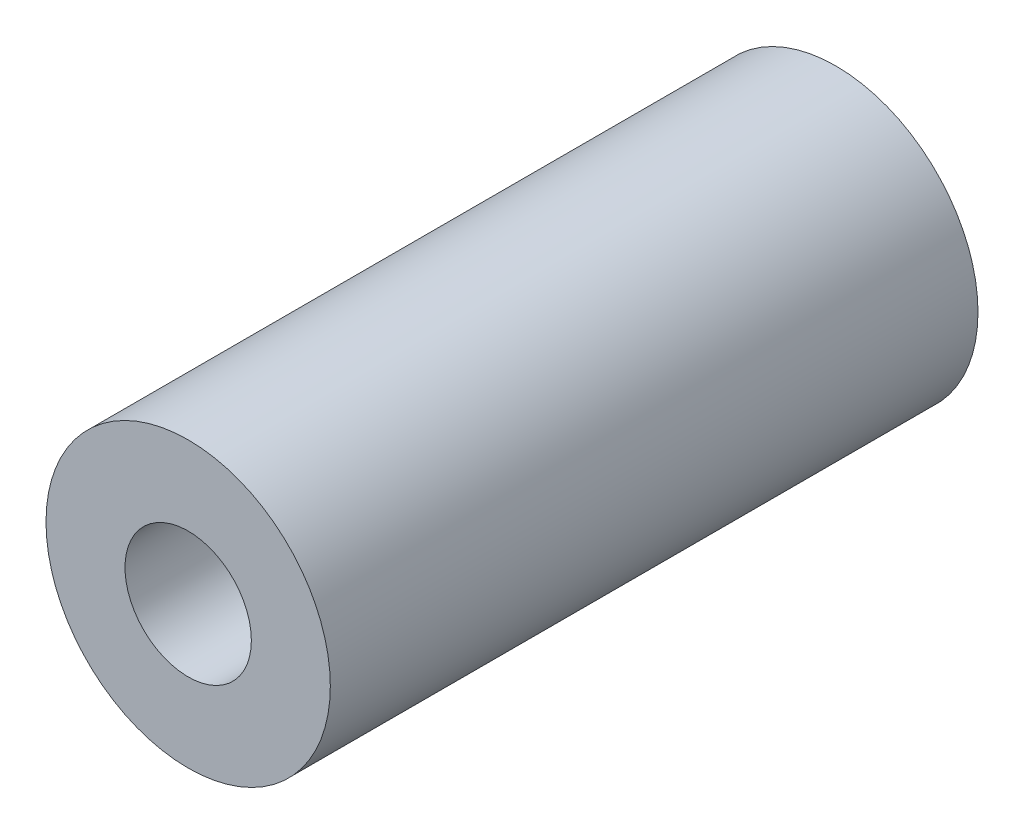
ISO-10303-21;
HEADER;
FILE_DESCRIPTION(('STEP AP214'),'2;1');
FILE_NAME('part.step','',(''),(''),'','','');
FILE_SCHEMA(('AUTOMOTIVE_DESIGN { 1 0 10303 214 1 1 1 1 }'));
ENDSEC;
DATA;
#1=APPLICATION_CONTEXT('core data for automotive mechanical design processes');
#2=APPLICATION_PROTOCOL_DEFINITION('international standard','automotive_design',2000,#1);
#3=PRODUCT_CONTEXT('',#1,'mechanical');
#4=PRODUCT('Part','Part','',(#3));
#5=PRODUCT_RELATED_PRODUCT_CATEGORY('part','',(#4));
#6=PRODUCT_DEFINITION_FORMATION('','',#4);
#7=PRODUCT_DEFINITION_CONTEXT('part definition',#1,'design');
#8=PRODUCT_DEFINITION('design','',#6,#7);
#9=PRODUCT_DEFINITION_SHAPE('','',#8);
#10=(LENGTH_UNIT() NAMED_UNIT(*) SI_UNIT(.MILLI.,.METRE.));
#11=(NAMED_UNIT(*) PLANE_ANGLE_UNIT() SI_UNIT($,.RADIAN.));
#12=(NAMED_UNIT(*) SI_UNIT($,.STERADIAN.) SOLID_ANGLE_UNIT());
#13=UNCERTAINTY_MEASURE_WITH_UNIT(LENGTH_MEASURE(1.E-05),#10,'distance_accuracy_value','');
#14=(GEOMETRIC_REPRESENTATION_CONTEXT(3) GLOBAL_UNCERTAINTY_ASSIGNED_CONTEXT((#13)) GLOBAL_UNIT_ASSIGNED_CONTEXT((#10,
#11,#12)) REPRESENTATION_CONTEXT('',''));
#15=CARTESIAN_POINT('',(0.,0.,0.));
#16=DIRECTION('',(0.,0.,1.));
#17=DIRECTION('',(1.,0.,0.));
#18=AXIS2_PLACEMENT_3D('',#15,#16,#17);
#19=CARTESIAN_POINT('',(0.,0.,20.5));
#20=DIRECTION('',(0.,0.,1.));
#21=DIRECTION('',(1.,0.,0.));
#22=AXIS2_PLACEMENT_3D('',#19,#20,#21);
#23=PLANE('',#22);
#24=CARTESIAN_POINT('',(0.,0.,20.5));
#25=DIRECTION('',(0.,0.,1.));
#26=DIRECTION('',(1.,0.,0.));
#27=AXIS2_PLACEMENT_3D('',#24,#25,#26);
#28=CIRCLE('',#27,4.5);
#29=CARTESIAN_POINT('',(4.5,0.,20.5));
#30=VERTEX_POINT('',#29);
#31=EDGE_CURVE('E10',#30,#30,#28,.T.);
#32=ORIENTED_EDGE('',*,*,#31,.T.);
#33=EDGE_LOOP('',(#32));
#34=FACE_BOUND('',#33,.T.);
#35=CARTESIAN_POINT('',(0.,0.,20.5));
#36=DIRECTION('',(0.,0.,1.));
#37=DIRECTION('',(1.,0.,0.));
#38=AXIS2_PLACEMENT_3D('',#35,#36,#37);
#39=CIRCLE('',#38,2.);
#40=CARTESIAN_POINT('',(2.,0.,20.5));
#41=VERTEX_POINT('',#40);
#42=EDGE_CURVE('E54',#41,#41,#39,.T.);
#43=ORIENTED_EDGE('',*,*,#42,.F.);
#44=EDGE_LOOP('',(#43));
#45=FACE_BOUND('',#44,.T.);
#46=ADVANCED_FACE('F41',(#34,#45),#23,.T.);
#47=CARTESIAN_POINT('',(0.,0.,0.));
#48=DIRECTION('',(0.,0.,1.));
#49=DIRECTION('',(1.,0.,0.));
#50=AXIS2_PLACEMENT_3D('',#47,#48,#49);
#51=PLANE('',#50);
#52=CARTESIAN_POINT('',(0.,0.,0.));
#53=DIRECTION('',(0.,0.,1.));
#54=DIRECTION('',(1.,0.,0.));
#55=AXIS2_PLACEMENT_3D('',#52,#53,#54);
#56=CIRCLE('',#55,4.5);
#57=CARTESIAN_POINT('',(4.5,0.,0.));
#58=VERTEX_POINT('',#57);
#59=EDGE_CURVE('E45',#58,#58,#56,.T.);
#60=ORIENTED_EDGE('',*,*,#59,.F.);
#61=EDGE_LOOP('',(#60));
#62=FACE_BOUND('',#61,.T.);
#63=CARTESIAN_POINT('',(0.,0.,0.));
#64=DIRECTION('',(0.,0.,1.));
#65=DIRECTION('',(1.,0.,0.));
#66=AXIS2_PLACEMENT_3D('',#63,#64,#65);
#67=CIRCLE('',#66,2.);
#68=CARTESIAN_POINT('',(2.,0.,0.));
#69=VERTEX_POINT('',#68);
#70=EDGE_CURVE('E56',#69,#69,#67,.T.);
#71=ORIENTED_EDGE('',*,*,#70,.T.);
#72=EDGE_LOOP('',(#71));
#73=FACE_BOUND('',#72,.T.);
#74=ADVANCED_FACE('F68',(#62,#73),#51,.F.);
#75=CARTESIAN_POINT('',(0.,0.,20.5));
#76=DIRECTION('',(0.,0.,-1.));
#77=DIRECTION('',(-1.,0.,0.));
#78=AXIS2_PLACEMENT_3D('',#75,#76,#77);
#79=CYLINDRICAL_SURFACE('',#78,4.5);
#80=ORIENTED_EDGE('',*,*,#31,.F.);
#81=EDGE_LOOP('',(#80));
#82=FACE_BOUND('',#81,.T.);
#83=ORIENTED_EDGE('',*,*,#59,.T.);
#84=EDGE_LOOP('',(#83));
#85=FACE_BOUND('',#84,.T.);
#86=ADVANCED_FACE('F43',(#82,#85),#79,.T.);
#87=CARTESIAN_POINT('',(0.,0.,20.5));
#88=DIRECTION('',(0.,0.,-1.));
#89=DIRECTION('',(-1.,0.,0.));
#90=AXIS2_PLACEMENT_3D('',#87,#88,#89);
#91=CYLINDRICAL_SURFACE('',#90,2.);
#92=ORIENTED_EDGE('',*,*,#42,.T.);
#93=EDGE_LOOP('',(#92));
#94=FACE_BOUND('',#93,.T.);
#95=ORIENTED_EDGE('',*,*,#70,.F.);
#96=EDGE_LOOP('',(#95));
#97=FACE_BOUND('',#96,.T.);
#98=ADVANCED_FACE('F64',(#94,#97),#91,.F.);
#99=CLOSED_SHELL('',(#46,#74,#86,#98));
#100=MANIFOLD_SOLID_BREP('B2',#99);
#101=ADVANCED_BREP_SHAPE_REPRESENTATION('',(#18,#100),#14);
#102=SHAPE_DEFINITION_REPRESENTATION(#9,#101);
ENDSEC;
END-ISO-10303-21;
